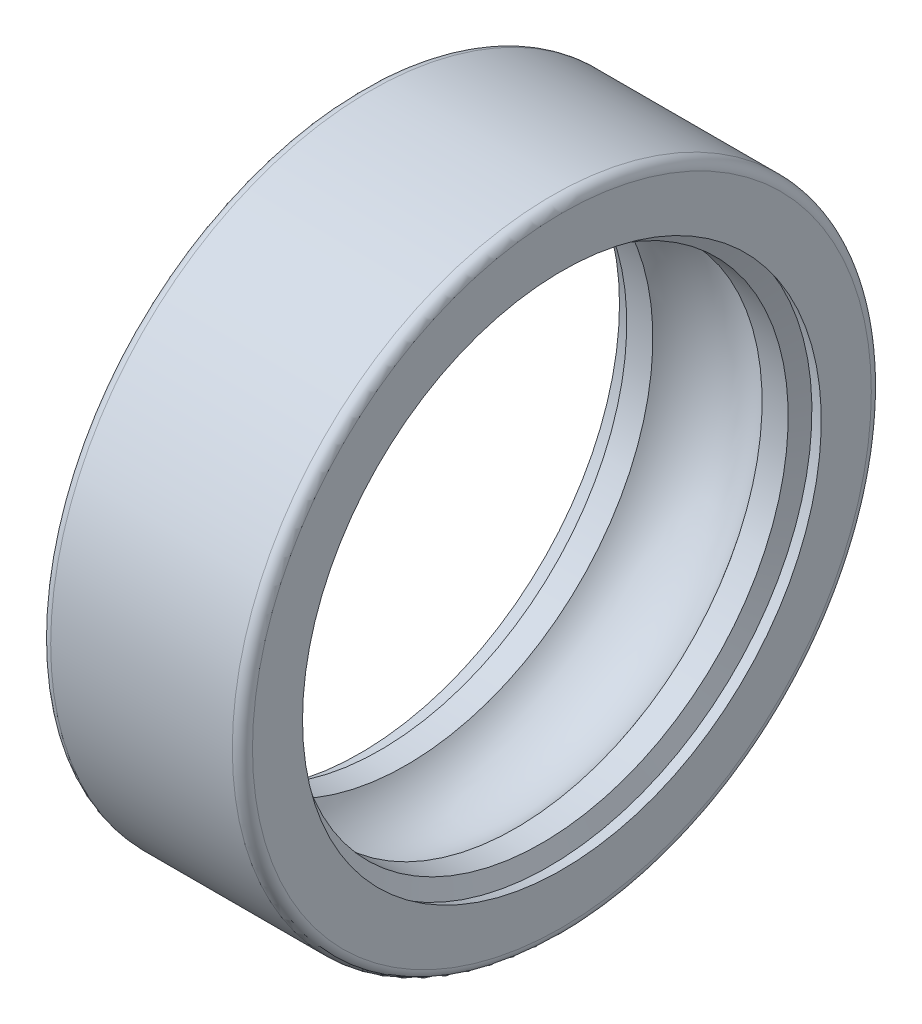
ISO-10303-21;
HEADER;
FILE_DESCRIPTION(('STEP AP214'),'2;1');
FILE_NAME('part.step','',(''),(''),'','','');
FILE_SCHEMA(('AUTOMOTIVE_DESIGN { 1 0 10303 214 1 1 1 1 }'));
ENDSEC;
DATA;
#1=APPLICATION_CONTEXT('core data for automotive mechanical design processes');
#2=APPLICATION_PROTOCOL_DEFINITION('international standard','automotive_design',2000,#1);
#3=PRODUCT_CONTEXT('',#1,'mechanical');
#4=PRODUCT('Part','Part','',(#3));
#5=PRODUCT_RELATED_PRODUCT_CATEGORY('part','',(#4));
#6=PRODUCT_DEFINITION_FORMATION('','',#4);
#7=PRODUCT_DEFINITION_CONTEXT('part definition',#1,'design');
#8=PRODUCT_DEFINITION('design','',#6,#7);
#9=PRODUCT_DEFINITION_SHAPE('','',#8);
#10=(LENGTH_UNIT() NAMED_UNIT(*) SI_UNIT(.MILLI.,.METRE.));
#11=(NAMED_UNIT(*) PLANE_ANGLE_UNIT() SI_UNIT($,.RADIAN.));
#12=(NAMED_UNIT(*) SI_UNIT($,.STERADIAN.) SOLID_ANGLE_UNIT());
#13=UNCERTAINTY_MEASURE_WITH_UNIT(LENGTH_MEASURE(1.E-05),#10,'distance_accuracy_value','');
#14=(GEOMETRIC_REPRESENTATION_CONTEXT(3) GLOBAL_UNCERTAINTY_ASSIGNED_CONTEXT((#13)) GLOBAL_UNIT_ASSIGNED_CONTEXT((#10,
#11,#12)) REPRESENTATION_CONTEXT('',''));
#15=CARTESIAN_POINT('',(0.,0.,0.));
#16=DIRECTION('',(0.,0.,1.));
#17=DIRECTION('',(1.,0.,0.));
#18=AXIS2_PLACEMENT_3D('',#15,#16,#17);
#19=CARTESIAN_POINT('',(3.,0.,0.));
#20=DIRECTION('',(-1.,0.,0.));
#21=DIRECTION('',(0.,0.,1.));
#22=AXIS2_PLACEMENT_3D('',#19,#20,#21);
#23=CYLINDRICAL_SURFACE('',#22,9.5);
#24=CARTESIAN_POINT('',(5.7,0.,0.));
#25=DIRECTION('',(-1.,0.,0.));
#26=DIRECTION('',(0.,0.,1.));
#27=AXIS2_PLACEMENT_3D('',#24,#25,#26);
#28=CIRCLE('',#27,9.5);
#29=CARTESIAN_POINT('',(5.7,0.,9.5));
#30=VERTEX_POINT('',#29);
#31=EDGE_CURVE('E90',#30,#30,#28,.F.);
#32=ORIENTED_EDGE('',*,*,#31,.F.);
#33=EDGE_LOOP('',(#32));
#34=FACE_BOUND('',#33,.T.);
#35=CARTESIAN_POINT('',(0.300000000000002,0.,0.));
#36=DIRECTION('',(-1.,0.,0.));
#37=DIRECTION('',(0.,0.,1.));
#38=AXIS2_PLACEMENT_3D('',#35,#36,#37);
#39=CIRCLE('',#38,9.5);
#40=CARTESIAN_POINT('',(0.300000000000002,0.,9.5));
#41=VERTEX_POINT('',#40);
#42=EDGE_CURVE('E86',#41,#41,#39,.T.);
#43=ORIENTED_EDGE('',*,*,#42,.F.);
#44=EDGE_LOOP('',(#43));
#45=FACE_BOUND('',#44,.T.);
#46=ADVANCED_FACE('F16',(#34,#45),#23,.T.);
#47=CARTESIAN_POINT('',(5.7,0.,0.));
#48=DIRECTION('',(-1.,0.,0.));
#49=DIRECTION('',(0.,0.,1.));
#50=AXIS2_PLACEMENT_3D('',#47,#48,#49);
#51=TOROIDAL_SURFACE('',#50,9.2,0.300000000000001);
#52=CARTESIAN_POINT('',(6.,0.,0.));
#53=DIRECTION('',(-1.,0.,0.));
#54=DIRECTION('',(0.,0.,-1.));
#55=AXIS2_PLACEMENT_3D('',#52,#53,#54);
#56=CIRCLE('',#55,9.2);
#57=CARTESIAN_POINT('',(6.,0.,-9.2));
#58=VERTEX_POINT('',#57);
#59=EDGE_CURVE('E89',#58,#58,#56,.F.);
#60=ORIENTED_EDGE('',*,*,#59,.F.);
#61=EDGE_LOOP('',(#60));
#62=FACE_BOUND('',#61,.T.);
#63=ORIENTED_EDGE('',*,*,#31,.T.);
#64=EDGE_LOOP('',(#63));
#65=FACE_BOUND('',#64,.T.);
#66=ADVANCED_FACE('F104',(#62,#65),#51,.T.);
#67=CARTESIAN_POINT('',(0.300000000000002,0.,0.));
#68=DIRECTION('',(-1.,0.,0.));
#69=DIRECTION('',(0.,0.,1.));
#70=AXIS2_PLACEMENT_3D('',#67,#68,#69);
#71=TOROIDAL_SURFACE('',#70,9.2,0.300000000000001);
#72=ORIENTED_EDGE('',*,*,#42,.T.);
#73=EDGE_LOOP('',(#72));
#74=FACE_BOUND('',#73,.T.);
#75=CARTESIAN_POINT('',(0.,0.,0.));
#76=DIRECTION('',(1.,0.,0.));
#77=DIRECTION('',(0.,0.,-1.));
#78=AXIS2_PLACEMENT_3D('',#75,#76,#77);
#79=CIRCLE('',#78,9.2);
#80=CARTESIAN_POINT('',(0.,0.,-9.2));
#81=VERTEX_POINT('',#80);
#82=EDGE_CURVE('E49',#81,#81,#79,.F.);
#83=ORIENTED_EDGE('',*,*,#82,.F.);
#84=EDGE_LOOP('',(#83));
#85=FACE_BOUND('',#84,.T.);
#86=ADVANCED_FACE('F73',(#74,#85),#71,.T.);
#87=CARTESIAN_POINT('',(6.,8.45625,0.));
#88=DIRECTION('',(1.,0.,0.));
#89=DIRECTION('',(0.,0.,-1.));
#90=AXIS2_PLACEMENT_3D('',#87,#88,#89);
#91=PLANE('',#90);
#92=CARTESIAN_POINT('',(6.,0.,0.));
#93=DIRECTION('',(-1.,0.,0.));
#94=DIRECTION('',(0.,0.,1.));
#95=AXIS2_PLACEMENT_3D('',#92,#93,#94);
#96=CIRCLE('',#95,7.71250000000001);
#97=CARTESIAN_POINT('',(6.,0.,7.71250000000001));
#98=VERTEX_POINT('',#97);
#99=EDGE_CURVE('E19',#98,#98,#96,.T.);
#100=ORIENTED_EDGE('',*,*,#99,.T.);
#101=EDGE_LOOP('',(#100));
#102=FACE_BOUND('',#101,.T.);
#103=ORIENTED_EDGE('',*,*,#59,.T.);
#104=EDGE_LOOP('',(#103));
#105=FACE_BOUND('',#104,.T.);
#106=ADVANCED_FACE('F67',(#102,#105),#91,.T.);
#107=CARTESIAN_POINT('',(0.,8.45625,0.));
#108=DIRECTION('',(-1.,0.,0.));
#109=DIRECTION('',(0.,0.,1.));
#110=AXIS2_PLACEMENT_3D('',#107,#108,#109);
#111=PLANE('',#110);
#112=CARTESIAN_POINT('',(0.,0.,0.));
#113=DIRECTION('',(1.,0.,0.));
#114=DIRECTION('',(0.,0.,-1.));
#115=AXIS2_PLACEMENT_3D('',#112,#113,#114);
#116=CIRCLE('',#115,7.7125);
#117=CARTESIAN_POINT('',(0.,0.,-7.7125));
#118=VERTEX_POINT('',#117);
#119=EDGE_CURVE('E44',#118,#118,#116,.T.);
#120=ORIENTED_EDGE('',*,*,#119,.T.);
#121=EDGE_LOOP('',(#120));
#122=FACE_BOUND('',#121,.T.);
#123=ORIENTED_EDGE('',*,*,#82,.T.);
#124=EDGE_LOOP('',(#123));
#125=FACE_BOUND('',#124,.T.);
#126=ADVANCED_FACE('F56',(#122,#125),#111,.T.);
#127=CARTESIAN_POINT('',(5.61022769398884,0.,0.));
#128=DIRECTION('',(-1.,0.,0.));
#129=DIRECTION('',(0.,0.,1.));
#130=AXIS2_PLACEMENT_3D('',#127,#128,#129);
#131=CONICAL_SURFACE('',#130,7.82426541024528,0.279252680319094);
#132=CARTESIAN_POINT('',(5.61022769398884,0.,0.));
#133=DIRECTION('',(1.,0.,0.));
#134=DIRECTION('',(0.,1.,0.));
#135=AXIS2_PLACEMENT_3D('',#132,#133,#134);
#136=CIRCLE('',#135,7.82426541024527);
#137=CARTESIAN_POINT('',(5.61022769398884,7.82426541024527,0.));
#138=VERTEX_POINT('',#137);
#139=EDGE_CURVE('E41',#138,#138,#136,.F.);
#140=ORIENTED_EDGE('',*,*,#139,.T.);
#141=EDGE_LOOP('',(#140));
#142=FACE_BOUND('',#141,.T.);
#143=ORIENTED_EDGE('',*,*,#99,.F.);
#144=EDGE_LOOP('',(#143));
#145=FACE_BOUND('',#144,.T.);
#146=ADVANCED_FACE('F66',(#142,#145),#131,.F.);
#147=CARTESIAN_POINT('',(0.389772306011163,0.,0.));
#148=DIRECTION('',(1.,0.,0.));
#149=DIRECTION('',(0.,0.,-1.));
#150=AXIS2_PLACEMENT_3D('',#147,#148,#149);
#151=CONICAL_SURFACE('',#150,7.82426541024528,0.279252680319091);
#152=CARTESIAN_POINT('',(0.389772306011167,0.,0.));
#153=DIRECTION('',(-1.,0.,0.));
#154=DIRECTION('',(0.,1.,0.));
#155=AXIS2_PLACEMENT_3D('',#152,#153,#154);
#156=CIRCLE('',#155,7.82426541024527);
#157=CARTESIAN_POINT('',(0.389772306011168,7.82426541024527,0.));
#158=VERTEX_POINT('',#157);
#159=EDGE_CURVE('E38',#158,#158,#156,.F.);
#160=ORIENTED_EDGE('',*,*,#159,.T.);
#161=EDGE_LOOP('',(#160));
#162=FACE_BOUND('',#161,.T.);
#163=ORIENTED_EDGE('',*,*,#119,.F.);
#164=EDGE_LOOP('',(#163));
#165=FACE_BOUND('',#164,.T.);
#166=ADVANCED_FACE('F154',(#162,#165),#151,.F.);
#167=CARTESIAN_POINT('',(5.61022769398884,0.,0.));
#168=DIRECTION('',(1.,0.,0.));
#169=DIRECTION('',(0.,0.,-1.));
#170=AXIS2_PLACEMENT_3D('',#167,#168,#169);
#171=CONICAL_SURFACE('',#170,7.82426541024527,1.1693705988362);
#172=CARTESIAN_POINT('',(5.4,0.,0.));
#173=DIRECTION('',(-1.,0.,0.));
#174=DIRECTION('',(0.,0.,1.));
#175=AXIS2_PLACEMENT_3D('',#172,#173,#174);
#176=CIRCLE('',#175,7.329);
#177=CARTESIAN_POINT('',(5.4,0.,7.329));
#178=VERTEX_POINT('',#177);
#179=EDGE_CURVE('E35',#178,#178,#176,.T.);
#180=ORIENTED_EDGE('',*,*,#179,.T.);
#181=EDGE_LOOP('',(#180));
#182=FACE_BOUND('',#181,.T.);
#183=ORIENTED_EDGE('',*,*,#139,.F.);
#184=EDGE_LOOP('',(#183));
#185=FACE_BOUND('',#184,.T.);
#186=ADVANCED_FACE('F151',(#182,#185),#171,.F.);
#187=CARTESIAN_POINT('',(0.389772306011167,0.,0.));
#188=DIRECTION('',(-1.,0.,0.));
#189=DIRECTION('',(0.,0.,1.));
#190=AXIS2_PLACEMENT_3D('',#187,#188,#189);
#191=CONICAL_SURFACE('',#190,7.82426541024527,1.1693705988362);
#192=CARTESIAN_POINT('',(0.600000000000001,0.,0.));
#193=DIRECTION('',(-1.,0.,0.));
#194=DIRECTION('',(0.,0.,1.));
#195=AXIS2_PLACEMENT_3D('',#192,#193,#194);
#196=CIRCLE('',#195,7.329);
#197=CARTESIAN_POINT('',(0.600000000000001,0.,7.329));
#198=VERTEX_POINT('',#197);
#199=EDGE_CURVE('E28',#198,#198,#196,.F.);
#200=ORIENTED_EDGE('',*,*,#199,.T.);
#201=EDGE_LOOP('',(#200));
#202=FACE_BOUND('',#201,.T.);
#203=ORIENTED_EDGE('',*,*,#159,.F.);
#204=EDGE_LOOP('',(#203));
#205=FACE_BOUND('',#204,.T.);
#206=ADVANCED_FACE('F147',(#202,#205),#191,.F.);
#207=CARTESIAN_POINT('',(5.01213591842745,0.,0.));
#208=DIRECTION('',(-1.,0.,0.));
#209=DIRECTION('',(0.,0.,1.));
#210=AXIS2_PLACEMENT_3D('',#207,#208,#209);
#211=CYLINDRICAL_SURFACE('',#210,7.329);
#212=CARTESIAN_POINT('',(4.6242718368549,0.,0.));
#213=DIRECTION('',(-1.,0.,0.));
#214=DIRECTION('',(0.,0.,1.));
#215=AXIS2_PLACEMENT_3D('',#212,#213,#214);
#216=CIRCLE('',#215,7.329);
#217=CARTESIAN_POINT('',(4.6242718368549,0.,7.329));
#218=VERTEX_POINT('',#217);
#219=EDGE_CURVE('E23',#218,#218,#216,.T.);
#220=ORIENTED_EDGE('',*,*,#219,.T.);
#221=EDGE_LOOP('',(#220));
#222=FACE_BOUND('',#221,.T.);
#223=ORIENTED_EDGE('',*,*,#179,.F.);
#224=EDGE_LOOP('',(#223));
#225=FACE_BOUND('',#224,.T.);
#226=ADVANCED_FACE('F141',(#222,#225),#211,.F.);
#227=CARTESIAN_POINT('',(0.987864081572549,0.,0.));
#228=DIRECTION('',(-1.,0.,0.));
#229=DIRECTION('',(0.,0.,1.));
#230=AXIS2_PLACEMENT_3D('',#227,#228,#229);
#231=CYLINDRICAL_SURFACE('',#230,7.329);
#232=CARTESIAN_POINT('',(1.3757281631451,0.,0.));
#233=DIRECTION('',(-1.,0.,0.));
#234=DIRECTION('',(0.,0.,1.));
#235=AXIS2_PLACEMENT_3D('',#232,#233,#234);
#236=CIRCLE('',#235,7.329);
#237=CARTESIAN_POINT('',(1.3757281631451,0.,7.329));
#238=VERTEX_POINT('',#237);
#239=EDGE_CURVE('E10',#238,#238,#236,.F.);
#240=ORIENTED_EDGE('',*,*,#239,.T.);
#241=EDGE_LOOP('',(#240));
#242=FACE_BOUND('',#241,.T.);
#243=ORIENTED_EDGE('',*,*,#199,.F.);
#244=EDGE_LOOP('',(#243));
#245=FACE_BOUND('',#244,.T.);
#246=ADVANCED_FACE('F136',(#242,#245),#231,.F.);
#247=CARTESIAN_POINT('',(3.,0.,0.));
#248=DIRECTION('',(-1.,0.,0.));
#249=DIRECTION('',(0.,0.,1.));
#250=AXIS2_PLACEMENT_3D('',#247,#248,#249);
#251=TOROIDAL_SURFACE('',#250,6.25,1.95);
#252=ORIENTED_EDGE('',*,*,#239,.F.);
#253=EDGE_LOOP('',(#252));
#254=FACE_BOUND('',#253,.T.);
#255=ORIENTED_EDGE('',*,*,#219,.F.);
#256=EDGE_LOOP('',(#255));
#257=FACE_BOUND('',#256,.T.);
#258=ADVANCED_FACE('F134',(#254,#257),#251,.F.);
#259=CLOSED_SHELL('',(#46,#66,#86,#106,#126,#146,#166,#186,#206,#226,#246,#258));
#260=MANIFOLD_SOLID_BREP('B1',#259);
#261=ADVANCED_BREP_SHAPE_REPRESENTATION('',(#18,#260),#14);
#262=SHAPE_DEFINITION_REPRESENTATION(#9,#261);
ENDSEC;
END-ISO-10303-21;
